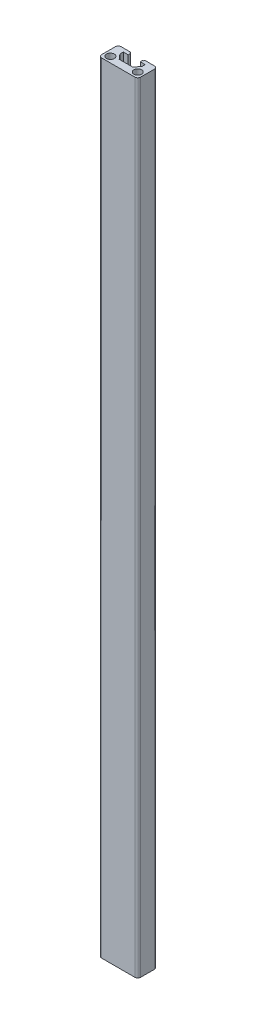
ISO-10303-21;
HEADER;
FILE_DESCRIPTION(('STEP AP214'),'2;1');
FILE_NAME('part.step','',(''),(''),'','','');
FILE_SCHEMA(('AUTOMOTIVE_DESIGN { 1 0 10303 214 1 1 1 1 }'));
ENDSEC;
DATA;
#1=APPLICATION_CONTEXT('core data for automotive mechanical design processes');
#2=APPLICATION_PROTOCOL_DEFINITION('international standard','automotive_design',2000,#1);
#3=PRODUCT_CONTEXT('',#1,'mechanical');
#4=PRODUCT('Part','Part','',(#3));
#5=PRODUCT_RELATED_PRODUCT_CATEGORY('part','',(#4));
#6=PRODUCT_DEFINITION_FORMATION('','',#4);
#7=PRODUCT_DEFINITION_CONTEXT('part definition',#1,'design');
#8=PRODUCT_DEFINITION('design','',#6,#7);
#9=PRODUCT_DEFINITION_SHAPE('','',#8);
#10=(LENGTH_UNIT() NAMED_UNIT(*) SI_UNIT(.MILLI.,.METRE.));
#11=(NAMED_UNIT(*) PLANE_ANGLE_UNIT() SI_UNIT($,.RADIAN.));
#12=(NAMED_UNIT(*) SI_UNIT($,.STERADIAN.) SOLID_ANGLE_UNIT());
#13=UNCERTAINTY_MEASURE_WITH_UNIT(LENGTH_MEASURE(1.E-05),#10,'distance_accuracy_value','');
#14=(GEOMETRIC_REPRESENTATION_CONTEXT(3) GLOBAL_UNCERTAINTY_ASSIGNED_CONTEXT((#13)) GLOBAL_UNIT_ASSIGNED_CONTEXT((#10,
#11,#12)) REPRESENTATION_CONTEXT('',''));
#15=CARTESIAN_POINT('',(0.,0.,0.));
#16=DIRECTION('',(0.,0.,1.));
#17=DIRECTION('',(1.,0.,0.));
#18=AXIS2_PLACEMENT_3D('',#15,#16,#17);
#19=CARTESIAN_POINT('',(0.,400.,0.));
#20=DIRECTION('',(0.,1.,0.));
#21=DIRECTION('',(0.,0.,1.));
#22=AXIS2_PLACEMENT_3D('',#19,#20,#21);
#23=PLANE('',#22);
#24=CARTESIAN_POINT('',(17.,400.,-3.));
#25=DIRECTION('',(0.,1.,0.));
#26=DIRECTION('',(0.,0.,1.));
#27=AXIS2_PLACEMENT_3D('',#24,#25,#26);
#28=CIRCLE('',#27,2.);
#29=CARTESIAN_POINT('',(17.,400.,-0.999999999999997));
#30=VERTEX_POINT('',#29);
#31=EDGE_CURVE('E262',#30,#30,#28,.T.);
#32=ORIENTED_EDGE('',*,*,#31,.F.);
#33=EDGE_LOOP('',(#32));
#34=FACE_BOUND('',#33,.T.);
#35=DIRECTION('',(-1.,0.,0.));
#36=VECTOR('',#35,1.);
#37=CARTESIAN_POINT('',(6.35,400.,-10.));
#38=LINE('',#37,#36);
#39=CARTESIAN_POINT('',(6.35,400.,-10.));
#40=VERTEX_POINT('',#39);
#41=CARTESIAN_POINT('',(1.5,400.,-10.));
#42=VERTEX_POINT('',#41);
#43=EDGE_CURVE('E253',#40,#42,#38,.T.);
#44=ORIENTED_EDGE('',*,*,#43,.T.);
#45=CARTESIAN_POINT('',(1.5,400.,-8.5));
#46=DIRECTION('',(0.,1.,0.));
#47=DIRECTION('',(0.,0.,1.));
#48=AXIS2_PLACEMENT_3D('',#45,#46,#47);
#49=CIRCLE('',#48,1.5);
#50=CARTESIAN_POINT('',(0.,400.,-8.5));
#51=VERTEX_POINT('',#50);
#52=EDGE_CURVE('E393',#42,#51,#49,.T.);
#53=ORIENTED_EDGE('',*,*,#52,.T.);
#54=DIRECTION('',(0.,0.,1.));
#55=VECTOR('',#54,1.);
#56=CARTESIAN_POINT('',(0.,400.,-10.));
#57=LINE('',#56,#55);
#58=CARTESIAN_POINT('',(0.,400.,-1.5));
#59=VERTEX_POINT('',#58);
#60=EDGE_CURVE('E314',#51,#59,#57,.T.);
#61=ORIENTED_EDGE('',*,*,#60,.T.);
#62=CARTESIAN_POINT('',(1.5,400.,-1.5));
#63=DIRECTION('',(0.,1.,0.));
#64=DIRECTION('',(0.,0.,1.));
#65=AXIS2_PLACEMENT_3D('',#62,#63,#64);
#66=CIRCLE('',#65,1.5);
#67=CARTESIAN_POINT('',(1.5,400.,0.));
#68=VERTEX_POINT('',#67);
#69=EDGE_CURVE('E390',#59,#68,#66,.T.);
#70=ORIENTED_EDGE('',*,*,#69,.T.);
#71=DIRECTION('',(1.,0.,0.));
#72=VECTOR('',#71,1.);
#73=CARTESIAN_POINT('',(0.,400.,0.));
#74=LINE('',#73,#72);
#75=CARTESIAN_POINT('',(18.5,400.,0.));
#76=VERTEX_POINT('',#75);
#77=EDGE_CURVE('E522',#68,#76,#74,.T.);
#78=ORIENTED_EDGE('',*,*,#77,.T.);
#79=CARTESIAN_POINT('',(18.5,400.,-1.5));
#80=DIRECTION('',(0.,1.,0.));
#81=DIRECTION('',(0.,0.,1.));
#82=AXIS2_PLACEMENT_3D('',#79,#80,#81);
#83=CIRCLE('',#82,1.5);
#84=CARTESIAN_POINT('',(20.,400.,-1.5));
#85=VERTEX_POINT('',#84);
#86=EDGE_CURVE('E385',#76,#85,#83,.T.);
#87=ORIENTED_EDGE('',*,*,#86,.T.);
#88=DIRECTION('',(0.,0.,-1.));
#89=VECTOR('',#88,1.);
#90=CARTESIAN_POINT('',(20.,400.,0.));
#91=LINE('',#90,#89);
#92=CARTESIAN_POINT('',(20.,400.,-8.5));
#93=VERTEX_POINT('',#92);
#94=EDGE_CURVE('E197',#85,#93,#91,.T.);
#95=ORIENTED_EDGE('',*,*,#94,.T.);
#96=CARTESIAN_POINT('',(18.5,400.,-8.5));
#97=DIRECTION('',(0.,1.,0.));
#98=DIRECTION('',(0.,0.,1.));
#99=AXIS2_PLACEMENT_3D('',#96,#97,#98);
#100=CIRCLE('',#99,1.5);
#101=CARTESIAN_POINT('',(18.5,400.,-10.));
#102=VERTEX_POINT('',#101);
#103=EDGE_CURVE('E55',#93,#102,#100,.T.);
#104=ORIENTED_EDGE('',*,*,#103,.T.);
#105=DIRECTION('',(-1.,0.,0.));
#106=VECTOR('',#105,1.);
#107=CARTESIAN_POINT('',(20.,400.,-10.));
#108=LINE('',#107,#106);
#109=CARTESIAN_POINT('',(13.65,400.,-10.));
#110=VERTEX_POINT('',#109);
#111=EDGE_CURVE('E186',#102,#110,#108,.T.);
#112=ORIENTED_EDGE('',*,*,#111,.T.);
#113=DIRECTION('',(0.,0.,1.));
#114=VECTOR('',#113,1.);
#115=CARTESIAN_POINT('',(13.65,400.,-9.51042760217637));
#116=LINE('',#115,#114);
#117=CARTESIAN_POINT('',(13.65,400.,-9.51042760217637));
#118=VERTEX_POINT('',#117);
#119=EDGE_CURVE('E191',#110,#118,#116,.T.);
#120=ORIENTED_EDGE('',*,*,#119,.T.);
#121=DIRECTION('',(-1.,0.,0.));
#122=VECTOR('',#121,1.);
#123=CARTESIAN_POINT('',(13.1,400.,-9.51042760217637));
#124=LINE('',#123,#122);
#125=CARTESIAN_POINT('',(13.1,400.,-9.51042760217637));
#126=VERTEX_POINT('',#125);
#127=EDGE_CURVE('E214',#118,#126,#124,.T.);
#128=ORIENTED_EDGE('',*,*,#127,.T.);
#129=DIRECTION('',(0.,0.,1.));
#130=VECTOR('',#129,1.);
#131=CARTESIAN_POINT('',(13.1,400.,-8.2));
#132=LINE('',#131,#130);
#133=CARTESIAN_POINT('',(13.1,400.,-8.2));
#134=VERTEX_POINT('',#133);
#135=EDGE_CURVE('E217',#126,#134,#132,.T.);
#136=ORIENTED_EDGE('',*,*,#135,.T.);
#137=DIRECTION('',(1.,0.,0.));
#138=VECTOR('',#137,1.);
#139=CARTESIAN_POINT('',(15.6,400.,-8.2));
#140=LINE('',#139,#138);
#141=CARTESIAN_POINT('',(15.6,400.,-8.2));
#142=VERTEX_POINT('',#141);
#143=EDGE_CURVE('E223',#134,#142,#140,.T.);
#144=ORIENTED_EDGE('',*,*,#143,.T.);
#145=DIRECTION('',(0.,0.,1.));
#146=VECTOR('',#145,1.);
#147=CARTESIAN_POINT('',(15.6,400.,-6.44750713590306));
#148=LINE('',#147,#146);
#149=CARTESIAN_POINT('',(15.6,400.,-6.44750713590306));
#150=VERTEX_POINT('',#149);
#151=EDGE_CURVE('E226',#142,#150,#148,.T.);
#152=ORIENTED_EDGE('',*,*,#151,.T.);
#153=DIRECTION('',(-0.651429062487269,0.,0.758709546893248));
#154=VECTOR('',#153,1.);
#155=CARTESIAN_POINT('',(13.4127068625717,400.,-3.9));
#156=LINE('',#155,#154);
#157=CARTESIAN_POINT('',(13.4127068625717,400.,-3.9));
#158=VERTEX_POINT('',#157);
#159=EDGE_CURVE('E229',#150,#158,#156,.T.);
#160=ORIENTED_EDGE('',*,*,#159,.T.);
#161=DIRECTION('',(-1.,0.,0.));
#162=VECTOR('',#161,1.);
#163=CARTESIAN_POINT('',(6.58729313742833,400.,-3.9));
#164=LINE('',#163,#162);
#165=CARTESIAN_POINT('',(6.58729313742833,400.,-3.9));
#166=VERTEX_POINT('',#165);
#167=EDGE_CURVE('E232',#158,#166,#164,.T.);
#168=ORIENTED_EDGE('',*,*,#167,.T.);
#169=DIRECTION('',(-0.651429062487269,0.,-0.758709546893248));
#170=VECTOR('',#169,1.);
#171=CARTESIAN_POINT('',(4.4,400.,-6.44750713590306));
#172=LINE('',#171,#170);
#173=CARTESIAN_POINT('',(4.4,400.,-6.44750713590306));
#174=VERTEX_POINT('',#173);
#175=EDGE_CURVE('E235',#166,#174,#172,.T.);
#176=ORIENTED_EDGE('',*,*,#175,.T.);
#177=DIRECTION('',(0.,0.,-1.));
#178=VECTOR('',#177,1.);
#179=CARTESIAN_POINT('',(4.4,400.,-8.2));
#180=LINE('',#179,#178);
#181=CARTESIAN_POINT('',(4.4,400.,-8.2));
#182=VERTEX_POINT('',#181);
#183=EDGE_CURVE('E238',#174,#182,#180,.T.);
#184=ORIENTED_EDGE('',*,*,#183,.T.);
#185=DIRECTION('',(1.,0.,0.));
#186=VECTOR('',#185,1.);
#187=CARTESIAN_POINT('',(6.9,400.,-8.2));
#188=LINE('',#187,#186);
#189=CARTESIAN_POINT('',(6.9,400.,-8.2));
#190=VERTEX_POINT('',#189);
#191=EDGE_CURVE('E241',#182,#190,#188,.T.);
#192=ORIENTED_EDGE('',*,*,#191,.T.);
#193=DIRECTION('',(0.,0.,-1.));
#194=VECTOR('',#193,1.);
#195=CARTESIAN_POINT('',(6.9,400.,-9.51042760217637));
#196=LINE('',#195,#194);
#197=CARTESIAN_POINT('',(6.9,400.,-9.51042760217637));
#198=VERTEX_POINT('',#197);
#199=EDGE_CURVE('E244',#190,#198,#196,.T.);
#200=ORIENTED_EDGE('',*,*,#199,.T.);
#201=DIRECTION('',(-1.,0.,0.));
#202=VECTOR('',#201,1.);
#203=CARTESIAN_POINT('',(6.35,400.,-9.51042760217637));
#204=LINE('',#203,#202);
#205=CARTESIAN_POINT('',(6.35,400.,-9.51042760217637));
#206=VERTEX_POINT('',#205);
#207=EDGE_CURVE('E247',#198,#206,#204,.T.);
#208=ORIENTED_EDGE('',*,*,#207,.T.);
#209=DIRECTION('',(0.,0.,-1.));
#210=VECTOR('',#209,1.);
#211=CARTESIAN_POINT('',(6.35,400.,-10.));
#212=LINE('',#211,#210);
#213=EDGE_CURVE('E250',#206,#40,#212,.T.);
#214=ORIENTED_EDGE('',*,*,#213,.T.);
#215=EDGE_LOOP('',(#44,#53,#61,#70,#78,#87,#95,#104,#112,#120,#128,#136,#144,#152,#160,#168,
#176,#184,#192,#200,#208,#214));
#216=FACE_BOUND('',#215,.T.);
#217=CARTESIAN_POINT('',(3.,400.,-3.));
#218=DIRECTION('',(0.,1.,0.));
#219=DIRECTION('',(0.,0.,1.));
#220=AXIS2_PLACEMENT_3D('',#217,#218,#219);
#221=CIRCLE('',#220,2.);
#222=CARTESIAN_POINT('',(3.,400.,-1.));
#223=VERTEX_POINT('',#222);
#224=EDGE_CURVE('E572',#223,#223,#221,.T.);
#225=ORIENTED_EDGE('',*,*,#224,.F.);
#226=EDGE_LOOP('',(#225));
#227=FACE_BOUND('',#226,.T.);
#228=ADVANCED_FACE('F39',(#34,#216,#227),#23,.T.);
#229=CARTESIAN_POINT('',(0.,0.,0.));
#230=DIRECTION('',(0.,1.,0.));
#231=DIRECTION('',(0.,0.,1.));
#232=AXIS2_PLACEMENT_3D('',#229,#230,#231);
#233=PLANE('',#232);
#234=DIRECTION('',(0.,0.,1.));
#235=VECTOR('',#234,1.);
#236=CARTESIAN_POINT('',(0.,0.,-10.));
#237=LINE('',#236,#235);
#238=CARTESIAN_POINT('',(0.,0.,-8.5));
#239=VERTEX_POINT('',#238);
#240=CARTESIAN_POINT('',(0.,0.,-1.5));
#241=VERTEX_POINT('',#240);
#242=EDGE_CURVE('E257',#239,#241,#237,.T.);
#243=ORIENTED_EDGE('',*,*,#242,.F.);
#244=CARTESIAN_POINT('',(1.5,0.,-8.5));
#245=DIRECTION('',(0.,1.,0.));
#246=DIRECTION('',(0.,0.,1.));
#247=AXIS2_PLACEMENT_3D('',#244,#245,#246);
#248=CIRCLE('',#247,1.5);
#249=CARTESIAN_POINT('',(1.5,0.,-10.));
#250=VERTEX_POINT('',#249);
#251=EDGE_CURVE('E379',#239,#250,#248,.F.);
#252=ORIENTED_EDGE('',*,*,#251,.T.);
#253=DIRECTION('',(-1.,0.,0.));
#254=VECTOR('',#253,1.);
#255=CARTESIAN_POINT('',(6.35,0.,-10.));
#256=LINE('',#255,#254);
#257=CARTESIAN_POINT('',(6.35,0.,-10.));
#258=VERTEX_POINT('',#257);
#259=EDGE_CURVE('E310',#258,#250,#256,.T.);
#260=ORIENTED_EDGE('',*,*,#259,.F.);
#261=DIRECTION('',(0.,0.,-1.));
#262=VECTOR('',#261,1.);
#263=CARTESIAN_POINT('',(6.35,0.,-10.));
#264=LINE('',#263,#262);
#265=CARTESIAN_POINT('',(6.35,0.,-9.51042760217637));
#266=VERTEX_POINT('',#265);
#267=EDGE_CURVE('E307',#266,#258,#264,.T.);
#268=ORIENTED_EDGE('',*,*,#267,.F.);
#269=DIRECTION('',(-1.,0.,0.));
#270=VECTOR('',#269,1.);
#271=CARTESIAN_POINT('',(6.35,0.,-9.51042760217637));
#272=LINE('',#271,#270);
#273=CARTESIAN_POINT('',(6.9,0.,-9.51042760217637));
#274=VERTEX_POINT('',#273);
#275=EDGE_CURVE('E304',#274,#266,#272,.T.);
#276=ORIENTED_EDGE('',*,*,#275,.F.);
#277=DIRECTION('',(0.,0.,-1.));
#278=VECTOR('',#277,1.);
#279=CARTESIAN_POINT('',(6.9,0.,-9.51042760217637));
#280=LINE('',#279,#278);
#281=CARTESIAN_POINT('',(6.9,0.,-8.2));
#282=VERTEX_POINT('',#281);
#283=EDGE_CURVE('E301',#282,#274,#280,.T.);
#284=ORIENTED_EDGE('',*,*,#283,.F.);
#285=DIRECTION('',(1.,0.,0.));
#286=VECTOR('',#285,1.);
#287=CARTESIAN_POINT('',(6.9,0.,-8.2));
#288=LINE('',#287,#286);
#289=CARTESIAN_POINT('',(4.4,0.,-8.2));
#290=VERTEX_POINT('',#289);
#291=EDGE_CURVE('E298',#290,#282,#288,.T.);
#292=ORIENTED_EDGE('',*,*,#291,.F.);
#293=DIRECTION('',(0.,0.,-1.));
#294=VECTOR('',#293,1.);
#295=CARTESIAN_POINT('',(4.4,0.,-8.2));
#296=LINE('',#295,#294);
#297=CARTESIAN_POINT('',(4.4,0.,-6.44750713590306));
#298=VERTEX_POINT('',#297);
#299=EDGE_CURVE('E295',#298,#290,#296,.T.);
#300=ORIENTED_EDGE('',*,*,#299,.F.);
#301=DIRECTION('',(-0.651429062487269,0.,-0.758709546893248));
#302=VECTOR('',#301,1.);
#303=CARTESIAN_POINT('',(4.4,0.,-6.44750713590306));
#304=LINE('',#303,#302);
#305=CARTESIAN_POINT('',(6.58729313742833,0.,-3.9));
#306=VERTEX_POINT('',#305);
#307=EDGE_CURVE('E292',#306,#298,#304,.T.);
#308=ORIENTED_EDGE('',*,*,#307,.F.);
#309=DIRECTION('',(-1.,0.,0.));
#310=VECTOR('',#309,1.);
#311=CARTESIAN_POINT('',(6.58729313742833,0.,-3.9));
#312=LINE('',#311,#310);
#313=CARTESIAN_POINT('',(13.4127068625717,0.,-3.9));
#314=VERTEX_POINT('',#313);
#315=EDGE_CURVE('E289',#314,#306,#312,.T.);
#316=ORIENTED_EDGE('',*,*,#315,.F.);
#317=DIRECTION('',(-0.651429062487269,0.,0.758709546893248));
#318=VECTOR('',#317,1.);
#319=CARTESIAN_POINT('',(13.4127068625717,0.,-3.9));
#320=LINE('',#319,#318);
#321=CARTESIAN_POINT('',(15.6,0.,-6.44750713590306));
#322=VERTEX_POINT('',#321);
#323=EDGE_CURVE('E286',#322,#314,#320,.T.);
#324=ORIENTED_EDGE('',*,*,#323,.F.);
#325=DIRECTION('',(0.,0.,1.));
#326=VECTOR('',#325,1.);
#327=CARTESIAN_POINT('',(15.6,0.,-6.44750713590306));
#328=LINE('',#327,#326);
#329=CARTESIAN_POINT('',(15.6,0.,-8.2));
#330=VERTEX_POINT('',#329);
#331=EDGE_CURVE('E283',#330,#322,#328,.T.);
#332=ORIENTED_EDGE('',*,*,#331,.F.);
#333=DIRECTION('',(1.,0.,0.));
#334=VECTOR('',#333,1.);
#335=CARTESIAN_POINT('',(15.6,0.,-8.2));
#336=LINE('',#335,#334);
#337=CARTESIAN_POINT('',(13.1,0.,-8.2));
#338=VERTEX_POINT('',#337);
#339=EDGE_CURVE('E280',#338,#330,#336,.T.);
#340=ORIENTED_EDGE('',*,*,#339,.F.);
#341=DIRECTION('',(0.,0.,1.));
#342=VECTOR('',#341,1.);
#343=CARTESIAN_POINT('',(13.1,0.,-8.2));
#344=LINE('',#343,#342);
#345=CARTESIAN_POINT('',(13.1,0.,-9.51042760217637));
#346=VERTEX_POINT('',#345);
#347=EDGE_CURVE('E277',#346,#338,#344,.T.);
#348=ORIENTED_EDGE('',*,*,#347,.F.);
#349=DIRECTION('',(-1.,0.,0.));
#350=VECTOR('',#349,1.);
#351=CARTESIAN_POINT('',(13.1,0.,-9.51042760217637));
#352=LINE('',#351,#350);
#353=CARTESIAN_POINT('',(13.65,0.,-9.51042760217637));
#354=VERTEX_POINT('',#353);
#355=EDGE_CURVE('E274',#354,#346,#352,.T.);
#356=ORIENTED_EDGE('',*,*,#355,.F.);
#357=DIRECTION('',(0.,0.,1.));
#358=VECTOR('',#357,1.);
#359=CARTESIAN_POINT('',(13.65,0.,-9.51042760217637));
#360=LINE('',#359,#358);
#361=CARTESIAN_POINT('',(13.65,0.,-10.));
#362=VERTEX_POINT('',#361);
#363=EDGE_CURVE('E271',#362,#354,#360,.T.);
#364=ORIENTED_EDGE('',*,*,#363,.F.);
#365=DIRECTION('',(-1.,0.,0.));
#366=VECTOR('',#365,1.);
#367=CARTESIAN_POINT('',(20.,0.,-10.));
#368=LINE('',#367,#366);
#369=CARTESIAN_POINT('',(18.5,0.,-10.));
#370=VERTEX_POINT('',#369);
#371=EDGE_CURVE('E203',#370,#362,#368,.T.);
#372=ORIENTED_EDGE('',*,*,#371,.F.);
#373=CARTESIAN_POINT('',(18.5,0.,-8.5));
#374=DIRECTION('',(0.,1.,0.));
#375=DIRECTION('',(0.,0.,1.));
#376=AXIS2_PLACEMENT_3D('',#373,#374,#375);
#377=CIRCLE('',#376,1.5);
#378=CARTESIAN_POINT('',(20.,0.,-8.5));
#379=VERTEX_POINT('',#378);
#380=EDGE_CURVE('E373',#370,#379,#377,.F.);
#381=ORIENTED_EDGE('',*,*,#380,.T.);
#382=DIRECTION('',(0.,0.,-1.));
#383=VECTOR('',#382,1.);
#384=CARTESIAN_POINT('',(20.,0.,0.));
#385=LINE('',#384,#383);
#386=CARTESIAN_POINT('',(20.,0.,-1.5));
#387=VERTEX_POINT('',#386);
#388=EDGE_CURVE('E266',#387,#379,#385,.T.);
#389=ORIENTED_EDGE('',*,*,#388,.F.);
#390=CARTESIAN_POINT('',(18.5,0.,-1.5));
#391=DIRECTION('',(0.,1.,0.));
#392=DIRECTION('',(0.,0.,1.));
#393=AXIS2_PLACEMENT_3D('',#390,#391,#392);
#394=CIRCLE('',#393,1.5);
#395=CARTESIAN_POINT('',(18.5,0.,0.));
#396=VERTEX_POINT('',#395);
#397=EDGE_CURVE('E370',#387,#396,#394,.F.);
#398=ORIENTED_EDGE('',*,*,#397,.T.);
#399=DIRECTION('',(1.,0.,0.));
#400=VECTOR('',#399,1.);
#401=CARTESIAN_POINT('',(0.,0.,0.));
#402=LINE('',#401,#400);
#403=CARTESIAN_POINT('',(1.5,0.,0.));
#404=VERTEX_POINT('',#403);
#405=EDGE_CURVE('E261',#404,#396,#402,.T.);
#406=ORIENTED_EDGE('',*,*,#405,.F.);
#407=CARTESIAN_POINT('',(1.5,0.,-1.5));
#408=DIRECTION('',(0.,1.,0.));
#409=DIRECTION('',(0.,0.,1.));
#410=AXIS2_PLACEMENT_3D('',#407,#408,#409);
#411=CIRCLE('',#410,1.5);
#412=EDGE_CURVE('E376',#404,#241,#411,.F.);
#413=ORIENTED_EDGE('',*,*,#412,.T.);
#414=EDGE_LOOP('',(#243,#252,#260,#268,#276,#284,#292,#300,#308,#316,#324,#332,#340,#348,#356,
#364,#372,#381,#389,#398,#406,#413));
#415=FACE_BOUND('',#414,.T.);
#416=CARTESIAN_POINT('',(17.,0.,-3.));
#417=DIRECTION('',(0.,1.,0.));
#418=DIRECTION('',(0.,0.,1.));
#419=AXIS2_PLACEMENT_3D('',#416,#417,#418);
#420=CIRCLE('',#419,2.);
#421=CARTESIAN_POINT('',(17.,0.,-0.999999999999997));
#422=VERTEX_POINT('',#421);
#423=EDGE_CURVE('E528',#422,#422,#420,.T.);
#424=ORIENTED_EDGE('',*,*,#423,.T.);
#425=EDGE_LOOP('',(#424));
#426=FACE_BOUND('',#425,.T.);
#427=CARTESIAN_POINT('',(3.,0.,-3.));
#428=DIRECTION('',(0.,1.,0.));
#429=DIRECTION('',(0.,0.,1.));
#430=AXIS2_PLACEMENT_3D('',#427,#428,#429);
#431=CIRCLE('',#430,2.);
#432=CARTESIAN_POINT('',(3.,0.,-1.));
#433=VERTEX_POINT('',#432);
#434=EDGE_CURVE('E576',#433,#433,#431,.T.);
#435=ORIENTED_EDGE('',*,*,#434,.T.);
#436=EDGE_LOOP('',(#435));
#437=FACE_BOUND('',#436,.T.);
#438=ADVANCED_FACE('F414',(#415,#426,#437),#233,.F.);
#439=CARTESIAN_POINT('',(0.,400.,-10.));
#440=DIRECTION('',(1.,0.,0.));
#441=DIRECTION('',(0.,0.,-1.));
#442=AXIS2_PLACEMENT_3D('',#439,#440,#441);
#443=PLANE('',#442);
#444=ORIENTED_EDGE('',*,*,#60,.F.);
#445=DIRECTION('',(0.,-1.,0.));
#446=VECTOR('',#445,1.);
#447=CARTESIAN_POINT('',(0.,400.,-8.5));
#448=LINE('',#447,#446);
#449=EDGE_CURVE('E366',#51,#239,#448,.T.);
#450=ORIENTED_EDGE('',*,*,#449,.T.);
#451=ORIENTED_EDGE('',*,*,#242,.T.);
#452=DIRECTION('',(0.,-1.,0.));
#453=VECTOR('',#452,1.);
#454=CARTESIAN_POINT('',(0.,400.,-1.5));
#455=LINE('',#454,#453);
#456=EDGE_CURVE('E207',#241,#59,#455,.F.);
#457=ORIENTED_EDGE('',*,*,#456,.T.);
#458=EDGE_LOOP('',(#444,#450,#451,#457));
#459=FACE_BOUND('',#458,.T.);
#460=ADVANCED_FACE('F434',(#459),#443,.F.);
#461=CARTESIAN_POINT('',(0.,400.,0.));
#462=DIRECTION('',(0.,0.,-1.));
#463=DIRECTION('',(-1.,0.,0.));
#464=AXIS2_PLACEMENT_3D('',#461,#462,#463);
#465=PLANE('',#464);
#466=ORIENTED_EDGE('',*,*,#77,.F.);
#467=DIRECTION('',(0.,-1.,0.));
#468=VECTOR('',#467,1.);
#469=CARTESIAN_POINT('',(1.5,400.,0.));
#470=LINE('',#469,#468);
#471=EDGE_CURVE('E399',#68,#404,#470,.T.);
#472=ORIENTED_EDGE('',*,*,#471,.T.);
#473=ORIENTED_EDGE('',*,*,#405,.T.);
#474=DIRECTION('',(0.,-1.,0.));
#475=VECTOR('',#474,1.);
#476=CARTESIAN_POINT('',(18.5,400.,0.));
#477=LINE('',#476,#475);
#478=EDGE_CURVE('E396',#396,#76,#477,.F.);
#479=ORIENTED_EDGE('',*,*,#478,.T.);
#480=EDGE_LOOP('',(#466,#472,#473,#479));
#481=FACE_BOUND('',#480,.T.);
#482=ADVANCED_FACE('F499',(#481),#465,.F.);
#483=CARTESIAN_POINT('',(20.,400.,0.));
#484=DIRECTION('',(-1.,0.,0.));
#485=DIRECTION('',(0.,0.,1.));
#486=AXIS2_PLACEMENT_3D('',#483,#484,#485);
#487=PLANE('',#486);
#488=ORIENTED_EDGE('',*,*,#388,.T.);
#489=DIRECTION('',(0.,-1.,0.));
#490=VECTOR('',#489,1.);
#491=CARTESIAN_POINT('',(20.,400.,-8.5));
#492=LINE('',#491,#490);
#493=EDGE_CURVE('E11',#379,#93,#492,.F.);
#494=ORIENTED_EDGE('',*,*,#493,.T.);
#495=ORIENTED_EDGE('',*,*,#94,.F.);
#496=DIRECTION('',(0.,-1.,0.));
#497=VECTOR('',#496,1.);
#498=CARTESIAN_POINT('',(20.,400.,-1.5));
#499=LINE('',#498,#497);
#500=EDGE_CURVE('E48',#85,#387,#499,.T.);
#501=ORIENTED_EDGE('',*,*,#500,.T.);
#502=EDGE_LOOP('',(#488,#494,#495,#501));
#503=FACE_BOUND('',#502,.T.);
#504=ADVANCED_FACE('F409',(#503),#487,.F.);
#505=CARTESIAN_POINT('',(20.,400.,-10.));
#506=DIRECTION('',(0.,0.,1.));
#507=DIRECTION('',(1.,0.,0.));
#508=AXIS2_PLACEMENT_3D('',#505,#506,#507);
#509=PLANE('',#508);
#510=ORIENTED_EDGE('',*,*,#111,.F.);
#511=DIRECTION('',(0.,-1.,0.));
#512=VECTOR('',#511,1.);
#513=CARTESIAN_POINT('',(18.5,400.,-10.));
#514=LINE('',#513,#512);
#515=EDGE_CURVE('E403',#102,#370,#514,.T.);
#516=ORIENTED_EDGE('',*,*,#515,.T.);
#517=ORIENTED_EDGE('',*,*,#371,.T.);
#518=DIRECTION('',(0.,-1.,0.));
#519=VECTOR('',#518,1.);
#520=CARTESIAN_POINT('',(13.65,400.,-10.));
#521=LINE('',#520,#519);
#522=EDGE_CURVE('E200',#110,#362,#521,.T.);
#523=ORIENTED_EDGE('',*,*,#522,.F.);
#524=EDGE_LOOP('',(#510,#516,#517,#523));
#525=FACE_BOUND('',#524,.T.);
#526=ADVANCED_FACE('F201',(#525),#509,.F.);
#527=CARTESIAN_POINT('',(13.65,400.,-9.51042760217637));
#528=DIRECTION('',(1.,0.,0.));
#529=DIRECTION('',(0.,0.,-1.));
#530=AXIS2_PLACEMENT_3D('',#527,#528,#529);
#531=PLANE('',#530);
#532=ORIENTED_EDGE('',*,*,#363,.T.);
#533=DIRECTION('',(0.,-1.,0.));
#534=VECTOR('',#533,1.);
#535=CARTESIAN_POINT('',(13.65,400.,-9.51042760217637));
#536=LINE('',#535,#534);
#537=EDGE_CURVE('E208',#118,#354,#536,.T.);
#538=ORIENTED_EDGE('',*,*,#537,.F.);
#539=ORIENTED_EDGE('',*,*,#119,.F.);
#540=ORIENTED_EDGE('',*,*,#522,.T.);
#541=EDGE_LOOP('',(#532,#538,#539,#540));
#542=FACE_BOUND('',#541,.T.);
#543=ADVANCED_FACE('F210',(#542),#531,.F.);
#544=CARTESIAN_POINT('',(13.1,400.,-9.51042760217637));
#545=DIRECTION('',(0.,0.,1.));
#546=DIRECTION('',(1.,0.,0.));
#547=AXIS2_PLACEMENT_3D('',#544,#545,#546);
#548=PLANE('',#547);
#549=ORIENTED_EDGE('',*,*,#355,.T.);
#550=DIRECTION('',(0.,-1.,0.));
#551=VECTOR('',#550,1.);
#552=CARTESIAN_POINT('',(13.1,400.,-9.51042760217637));
#553=LINE('',#552,#551);
#554=EDGE_CURVE('E358',#126,#346,#553,.T.);
#555=ORIENTED_EDGE('',*,*,#554,.F.);
#556=ORIENTED_EDGE('',*,*,#127,.F.);
#557=ORIENTED_EDGE('',*,*,#537,.T.);
#558=EDGE_LOOP('',(#549,#555,#556,#557));
#559=FACE_BOUND('',#558,.T.);
#560=ADVANCED_FACE('F488',(#559),#548,.F.);
#561=CARTESIAN_POINT('',(13.1,400.,-8.2));
#562=DIRECTION('',(1.,0.,0.));
#563=DIRECTION('',(0.,0.,-1.));
#564=AXIS2_PLACEMENT_3D('',#561,#562,#563);
#565=PLANE('',#564);
#566=ORIENTED_EDGE('',*,*,#347,.T.);
#567=DIRECTION('',(0.,-1.,0.));
#568=VECTOR('',#567,1.);
#569=CARTESIAN_POINT('',(13.1,400.,-8.2));
#570=LINE('',#569,#568);
#571=EDGE_CURVE('E354',#134,#338,#570,.T.);
#572=ORIENTED_EDGE('',*,*,#571,.F.);
#573=ORIENTED_EDGE('',*,*,#135,.F.);
#574=ORIENTED_EDGE('',*,*,#554,.T.);
#575=EDGE_LOOP('',(#566,#572,#573,#574));
#576=FACE_BOUND('',#575,.T.);
#577=ADVANCED_FACE('F484',(#576),#565,.F.);
#578=CARTESIAN_POINT('',(15.6,400.,-8.2));
#579=DIRECTION('',(0.,0.,-1.));
#580=DIRECTION('',(-1.,0.,0.));
#581=AXIS2_PLACEMENT_3D('',#578,#579,#580);
#582=PLANE('',#581);
#583=ORIENTED_EDGE('',*,*,#339,.T.);
#584=DIRECTION('',(0.,-1.,0.));
#585=VECTOR('',#584,1.);
#586=CARTESIAN_POINT('',(15.6,400.,-8.2));
#587=LINE('',#586,#585);
#588=EDGE_CURVE('E350',#142,#330,#587,.T.);
#589=ORIENTED_EDGE('',*,*,#588,.F.);
#590=ORIENTED_EDGE('',*,*,#143,.F.);
#591=ORIENTED_EDGE('',*,*,#571,.T.);
#592=EDGE_LOOP('',(#583,#589,#590,#591));
#593=FACE_BOUND('',#592,.T.);
#594=ADVANCED_FACE('F480',(#593),#582,.F.);
#595=CARTESIAN_POINT('',(15.6,400.,-6.44750713590306));
#596=DIRECTION('',(1.,0.,0.));
#597=DIRECTION('',(0.,0.,-1.));
#598=AXIS2_PLACEMENT_3D('',#595,#596,#597);
#599=PLANE('',#598);
#600=ORIENTED_EDGE('',*,*,#331,.T.);
#601=DIRECTION('',(0.,-1.,0.));
#602=VECTOR('',#601,1.);
#603=CARTESIAN_POINT('',(15.6,400.,-6.44750713590306));
#604=LINE('',#603,#602);
#605=EDGE_CURVE('E346',#150,#322,#604,.T.);
#606=ORIENTED_EDGE('',*,*,#605,.F.);
#607=ORIENTED_EDGE('',*,*,#151,.F.);
#608=ORIENTED_EDGE('',*,*,#588,.T.);
#609=EDGE_LOOP('',(#600,#606,#607,#608));
#610=FACE_BOUND('',#609,.T.);
#611=ADVANCED_FACE('F476',(#610),#599,.F.);
#612=CARTESIAN_POINT('',(13.4127068625717,400.,-3.9));
#613=DIRECTION('',(0.758709546893248,0.,0.651429062487269));
#614=DIRECTION('',(0.651429062487269,0.,-0.758709546893248));
#615=AXIS2_PLACEMENT_3D('',#612,#613,#614);
#616=PLANE('',#615);
#617=ORIENTED_EDGE('',*,*,#323,.T.);
#618=DIRECTION('',(0.,-1.,0.));
#619=VECTOR('',#618,1.);
#620=CARTESIAN_POINT('',(13.4127068625717,400.,-3.9));
#621=LINE('',#620,#619);
#622=EDGE_CURVE('E342',#158,#314,#621,.T.);
#623=ORIENTED_EDGE('',*,*,#622,.F.);
#624=ORIENTED_EDGE('',*,*,#159,.F.);
#625=ORIENTED_EDGE('',*,*,#605,.T.);
#626=EDGE_LOOP('',(#617,#623,#624,#625));
#627=FACE_BOUND('',#626,.T.);
#628=ADVANCED_FACE('F472',(#627),#616,.F.);
#629=CARTESIAN_POINT('',(6.58729313742833,400.,-3.9));
#630=DIRECTION('',(0.,0.,1.));
#631=DIRECTION('',(1.,0.,0.));
#632=AXIS2_PLACEMENT_3D('',#629,#630,#631);
#633=PLANE('',#632);
#634=ORIENTED_EDGE('',*,*,#315,.T.);
#635=DIRECTION('',(0.,-1.,0.));
#636=VECTOR('',#635,1.);
#637=CARTESIAN_POINT('',(6.58729313742833,400.,-3.9));
#638=LINE('',#637,#636);
#639=EDGE_CURVE('E338',#166,#306,#638,.T.);
#640=ORIENTED_EDGE('',*,*,#639,.F.);
#641=ORIENTED_EDGE('',*,*,#167,.F.);
#642=ORIENTED_EDGE('',*,*,#622,.T.);
#643=EDGE_LOOP('',(#634,#640,#641,#642));
#644=FACE_BOUND('',#643,.T.);
#645=ADVANCED_FACE('F468',(#644),#633,.F.);
#646=CARTESIAN_POINT('',(4.4,400.,-6.44750713590306));
#647=DIRECTION('',(-0.758709546893248,0.,0.651429062487269));
#648=DIRECTION('',(0.651429062487269,0.,0.758709546893248));
#649=AXIS2_PLACEMENT_3D('',#646,#647,#648);
#650=PLANE('',#649);
#651=ORIENTED_EDGE('',*,*,#307,.T.);
#652=DIRECTION('',(0.,-1.,0.));
#653=VECTOR('',#652,1.);
#654=CARTESIAN_POINT('',(4.4,400.,-6.44750713590306));
#655=LINE('',#654,#653);
#656=EDGE_CURVE('E334',#174,#298,#655,.T.);
#657=ORIENTED_EDGE('',*,*,#656,.F.);
#658=ORIENTED_EDGE('',*,*,#175,.F.);
#659=ORIENTED_EDGE('',*,*,#639,.T.);
#660=EDGE_LOOP('',(#651,#657,#658,#659));
#661=FACE_BOUND('',#660,.T.);
#662=ADVANCED_FACE('F464',(#661),#650,.F.);
#663=CARTESIAN_POINT('',(4.4,400.,-8.2));
#664=DIRECTION('',(-1.,0.,0.));
#665=DIRECTION('',(0.,0.,1.));
#666=AXIS2_PLACEMENT_3D('',#663,#664,#665);
#667=PLANE('',#666);
#668=ORIENTED_EDGE('',*,*,#299,.T.);
#669=DIRECTION('',(0.,-1.,0.));
#670=VECTOR('',#669,1.);
#671=CARTESIAN_POINT('',(4.4,400.,-8.2));
#672=LINE('',#671,#670);
#673=EDGE_CURVE('E330',#182,#290,#672,.T.);
#674=ORIENTED_EDGE('',*,*,#673,.F.);
#675=ORIENTED_EDGE('',*,*,#183,.F.);
#676=ORIENTED_EDGE('',*,*,#656,.T.);
#677=EDGE_LOOP('',(#668,#674,#675,#676));
#678=FACE_BOUND('',#677,.T.);
#679=ADVANCED_FACE('F460',(#678),#667,.F.);
#680=CARTESIAN_POINT('',(6.9,400.,-8.2));
#681=DIRECTION('',(0.,0.,-1.));
#682=DIRECTION('',(-1.,0.,0.));
#683=AXIS2_PLACEMENT_3D('',#680,#681,#682);
#684=PLANE('',#683);
#685=ORIENTED_EDGE('',*,*,#291,.T.);
#686=DIRECTION('',(0.,-1.,0.));
#687=VECTOR('',#686,1.);
#688=CARTESIAN_POINT('',(6.9,400.,-8.2));
#689=LINE('',#688,#687);
#690=EDGE_CURVE('E326',#190,#282,#689,.T.);
#691=ORIENTED_EDGE('',*,*,#690,.F.);
#692=ORIENTED_EDGE('',*,*,#191,.F.);
#693=ORIENTED_EDGE('',*,*,#673,.T.);
#694=EDGE_LOOP('',(#685,#691,#692,#693));
#695=FACE_BOUND('',#694,.T.);
#696=ADVANCED_FACE('F456',(#695),#684,.F.);
#697=CARTESIAN_POINT('',(6.9,400.,-9.51042760217637));
#698=DIRECTION('',(-1.,0.,0.));
#699=DIRECTION('',(0.,0.,1.));
#700=AXIS2_PLACEMENT_3D('',#697,#698,#699);
#701=PLANE('',#700);
#702=ORIENTED_EDGE('',*,*,#283,.T.);
#703=DIRECTION('',(0.,-1.,0.));
#704=VECTOR('',#703,1.);
#705=CARTESIAN_POINT('',(6.9,400.,-9.51042760217637));
#706=LINE('',#705,#704);
#707=EDGE_CURVE('E322',#198,#274,#706,.T.);
#708=ORIENTED_EDGE('',*,*,#707,.F.);
#709=ORIENTED_EDGE('',*,*,#199,.F.);
#710=ORIENTED_EDGE('',*,*,#690,.T.);
#711=EDGE_LOOP('',(#702,#708,#709,#710));
#712=FACE_BOUND('',#711,.T.);
#713=ADVANCED_FACE('F452',(#712),#701,.F.);
#714=CARTESIAN_POINT('',(6.35,400.,-9.51042760217637));
#715=DIRECTION('',(0.,0.,1.));
#716=DIRECTION('',(1.,0.,0.));
#717=AXIS2_PLACEMENT_3D('',#714,#715,#716);
#718=PLANE('',#717);
#719=ORIENTED_EDGE('',*,*,#275,.T.);
#720=DIRECTION('',(0.,-1.,0.));
#721=VECTOR('',#720,1.);
#722=CARTESIAN_POINT('',(6.35,400.,-9.51042760217637));
#723=LINE('',#722,#721);
#724=EDGE_CURVE('E318',#206,#266,#723,.T.);
#725=ORIENTED_EDGE('',*,*,#724,.F.);
#726=ORIENTED_EDGE('',*,*,#207,.F.);
#727=ORIENTED_EDGE('',*,*,#707,.T.);
#728=EDGE_LOOP('',(#719,#725,#726,#727));
#729=FACE_BOUND('',#728,.T.);
#730=ADVANCED_FACE('F448',(#729),#718,.F.);
#731=CARTESIAN_POINT('',(6.35,400.,-10.));
#732=DIRECTION('',(-1.,0.,0.));
#733=DIRECTION('',(0.,0.,1.));
#734=AXIS2_PLACEMENT_3D('',#731,#732,#733);
#735=PLANE('',#734);
#736=ORIENTED_EDGE('',*,*,#267,.T.);
#737=DIRECTION('',(0.,-1.,0.));
#738=VECTOR('',#737,1.);
#739=CARTESIAN_POINT('',(6.35,400.,-10.));
#740=LINE('',#739,#738);
#741=EDGE_CURVE('E256',#40,#258,#740,.T.);
#742=ORIENTED_EDGE('',*,*,#741,.F.);
#743=ORIENTED_EDGE('',*,*,#213,.F.);
#744=ORIENTED_EDGE('',*,*,#724,.T.);
#745=EDGE_LOOP('',(#736,#742,#743,#744));
#746=FACE_BOUND('',#745,.T.);
#747=ADVANCED_FACE('F444',(#746),#735,.F.);
#748=CARTESIAN_POINT('',(6.35,400.,-10.));
#749=DIRECTION('',(0.,0.,1.));
#750=DIRECTION('',(1.,0.,0.));
#751=AXIS2_PLACEMENT_3D('',#748,#749,#750);
#752=PLANE('',#751);
#753=ORIENTED_EDGE('',*,*,#259,.T.);
#754=DIRECTION('',(0.,-1.,0.));
#755=VECTOR('',#754,1.);
#756=CARTESIAN_POINT('',(1.5,400.,-10.));
#757=LINE('',#756,#755);
#758=EDGE_CURVE('E382',#250,#42,#757,.F.);
#759=ORIENTED_EDGE('',*,*,#758,.T.);
#760=ORIENTED_EDGE('',*,*,#43,.F.);
#761=ORIENTED_EDGE('',*,*,#741,.T.);
#762=EDGE_LOOP('',(#753,#759,#760,#761));
#763=FACE_BOUND('',#762,.T.);
#764=ADVANCED_FACE('F441',(#763),#752,.F.);
#765=CARTESIAN_POINT('',(17.,400.,-3.));
#766=DIRECTION('',(0.,-1.,0.));
#767=DIRECTION('',(0.,0.,-1.));
#768=AXIS2_PLACEMENT_3D('',#765,#766,#767);
#769=CYLINDRICAL_SURFACE('',#768,2.);
#770=ORIENTED_EDGE('',*,*,#31,.T.);
#771=EDGE_LOOP('',(#770));
#772=FACE_BOUND('',#771,.T.);
#773=ORIENTED_EDGE('',*,*,#423,.F.);
#774=EDGE_LOOP('',(#773));
#775=FACE_BOUND('',#774,.T.);
#776=ADVANCED_FACE('F438',(#772,#775),#769,.F.);
#777=CARTESIAN_POINT('',(3.,400.,-3.));
#778=DIRECTION('',(0.,-1.,0.));
#779=DIRECTION('',(0.,0.,-1.));
#780=AXIS2_PLACEMENT_3D('',#777,#778,#779);
#781=CYLINDRICAL_SURFACE('',#780,2.);
#782=ORIENTED_EDGE('',*,*,#224,.T.);
#783=EDGE_LOOP('',(#782));
#784=FACE_BOUND('',#783,.T.);
#785=ORIENTED_EDGE('',*,*,#434,.F.);
#786=EDGE_LOOP('',(#785));
#787=FACE_BOUND('',#786,.T.);
#788=ADVANCED_FACE('F507',(#784,#787),#781,.F.);
#789=CARTESIAN_POINT('',(1.5,400.,-8.5));
#790=DIRECTION('',(0.,-1.,0.));
#791=DIRECTION('',(0.,0.,-1.));
#792=AXIS2_PLACEMENT_3D('',#789,#790,#791);
#793=CYLINDRICAL_SURFACE('',#792,1.5);
#794=ORIENTED_EDGE('',*,*,#52,.F.);
#795=ORIENTED_EDGE('',*,*,#758,.F.);
#796=ORIENTED_EDGE('',*,*,#251,.F.);
#797=ORIENTED_EDGE('',*,*,#449,.F.);
#798=EDGE_LOOP('',(#794,#795,#796,#797));
#799=FACE_BOUND('',#798,.T.);
#800=ADVANCED_FACE('F425',(#799),#793,.T.);
#801=CARTESIAN_POINT('',(1.5,400.,-1.5));
#802=DIRECTION('',(0.,-1.,0.));
#803=DIRECTION('',(0.,0.,-1.));
#804=AXIS2_PLACEMENT_3D('',#801,#802,#803);
#805=CYLINDRICAL_SURFACE('',#804,1.5);
#806=ORIENTED_EDGE('',*,*,#69,.F.);
#807=ORIENTED_EDGE('',*,*,#456,.F.);
#808=ORIENTED_EDGE('',*,*,#412,.F.);
#809=ORIENTED_EDGE('',*,*,#471,.F.);
#810=EDGE_LOOP('',(#806,#807,#808,#809));
#811=FACE_BOUND('',#810,.T.);
#812=ADVANCED_FACE('F420',(#811),#805,.T.);
#813=CARTESIAN_POINT('',(18.5,400.,-8.5));
#814=DIRECTION('',(0.,-1.,0.));
#815=DIRECTION('',(0.,0.,-1.));
#816=AXIS2_PLACEMENT_3D('',#813,#814,#815);
#817=CYLINDRICAL_SURFACE('',#816,1.5);
#818=ORIENTED_EDGE('',*,*,#103,.F.);
#819=ORIENTED_EDGE('',*,*,#493,.F.);
#820=ORIENTED_EDGE('',*,*,#380,.F.);
#821=ORIENTED_EDGE('',*,*,#515,.F.);
#822=EDGE_LOOP('',(#818,#819,#820,#821));
#823=FACE_BOUND('',#822,.T.);
#824=ADVANCED_FACE('F418',(#823),#817,.T.);
#825=CARTESIAN_POINT('',(18.5,400.,-1.5));
#826=DIRECTION('',(0.,-1.,0.));
#827=DIRECTION('',(0.,0.,-1.));
#828=AXIS2_PLACEMENT_3D('',#825,#826,#827);
#829=CYLINDRICAL_SURFACE('',#828,1.5);
#830=ORIENTED_EDGE('',*,*,#86,.F.);
#831=ORIENTED_EDGE('',*,*,#478,.F.);
#832=ORIENTED_EDGE('',*,*,#397,.F.);
#833=ORIENTED_EDGE('',*,*,#500,.F.);
#834=EDGE_LOOP('',(#830,#831,#832,#833));
#835=FACE_BOUND('',#834,.T.);
#836=ADVANCED_FACE('F41',(#835),#829,.T.);
#837=CLOSED_SHELL('',(#228,#438,#460,#482,#504,#526,#543,#560,#577,#594,#611,#628,#645,#662,
#679,#696,#713,#730,#747,#764,#776,#788,#800,#812,#824,#836));
#838=MANIFOLD_SOLID_BREP('B2',#837);
#839=ADVANCED_BREP_SHAPE_REPRESENTATION('',(#18,#838),#14);
#840=SHAPE_DEFINITION_REPRESENTATION(#9,#839);
ENDSEC;
END-ISO-10303-21;
